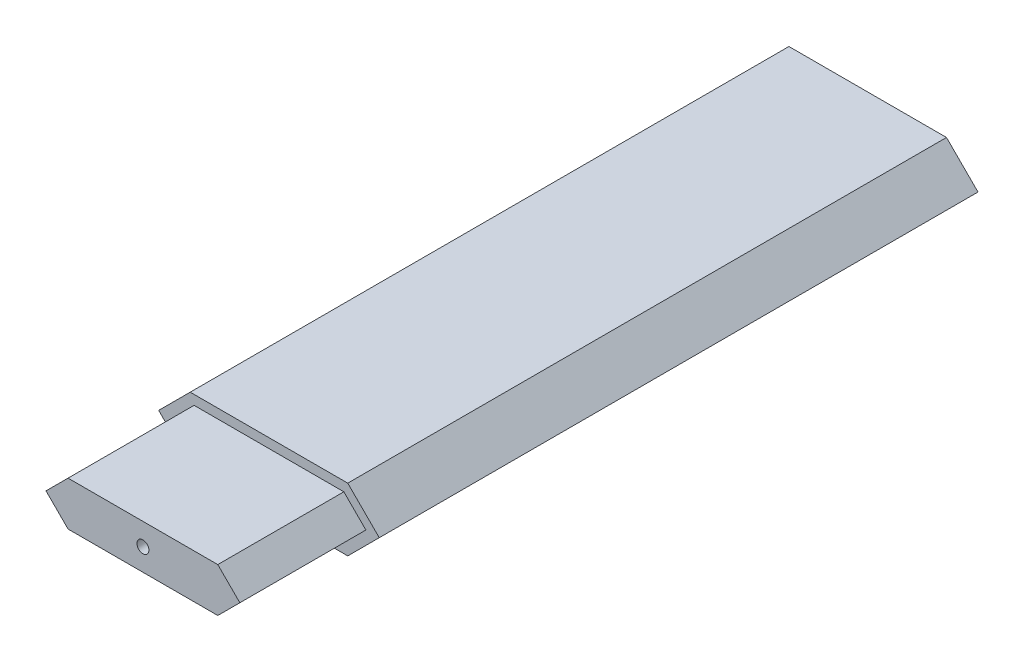
ISO-10303-21;
HEADER;
FILE_DESCRIPTION(('STEP AP214'),'2;1');
FILE_NAME('part.step','',(''),(''),'','','');
FILE_SCHEMA(('AUTOMOTIVE_DESIGN { 1 0 10303 214 1 1 1 1 }'));
ENDSEC;
DATA;
#1=APPLICATION_CONTEXT('core data for automotive mechanical design processes');
#2=APPLICATION_PROTOCOL_DEFINITION('international standard','automotive_design',2000,#1);
#3=PRODUCT_CONTEXT('',#1,'mechanical');
#4=PRODUCT('Part','Part','',(#3));
#5=PRODUCT_RELATED_PRODUCT_CATEGORY('part','',(#4));
#6=PRODUCT_DEFINITION_FORMATION('','',#4);
#7=PRODUCT_DEFINITION_CONTEXT('part definition',#1,'design');
#8=PRODUCT_DEFINITION('design','',#6,#7);
#9=PRODUCT_DEFINITION_SHAPE('','',#8);
#10=(LENGTH_UNIT() NAMED_UNIT(*) SI_UNIT(.MILLI.,.METRE.));
#11=(NAMED_UNIT(*) PLANE_ANGLE_UNIT() SI_UNIT($,.RADIAN.));
#12=(NAMED_UNIT(*) SI_UNIT($,.STERADIAN.) SOLID_ANGLE_UNIT());
#13=UNCERTAINTY_MEASURE_WITH_UNIT(LENGTH_MEASURE(1.E-05),#10,'distance_accuracy_value','');
#14=(GEOMETRIC_REPRESENTATION_CONTEXT(3) GLOBAL_UNCERTAINTY_ASSIGNED_CONTEXT((#13)) GLOBAL_UNIT_ASSIGNED_CONTEXT((#10,
#11,#12)) REPRESENTATION_CONTEXT('',''));
#15=CARTESIAN_POINT('',(0.,0.,0.));
#16=DIRECTION('',(0.,0.,1.));
#17=DIRECTION('',(1.,0.,0.));
#18=AXIS2_PLACEMENT_3D('',#15,#16,#17);
#19=CARTESIAN_POINT('',(0.,0.,-195.0001));
#20=DIRECTION('',(0.,0.,1.));
#21=DIRECTION('',(1.,0.,0.));
#22=AXIS2_PLACEMENT_3D('',#19,#20,#21);
#23=CYLINDRICAL_SURFACE('',#22,1.9);
#24=CARTESIAN_POINT('',(0.,0.,35.));
#25=DIRECTION('',(0.,0.,1.));
#26=DIRECTION('',(1.,0.,0.));
#27=AXIS2_PLACEMENT_3D('',#24,#25,#26);
#28=CIRCLE('',#27,1.9);
#29=CARTESIAN_POINT('',(1.9,0.,35.));
#30=VERTEX_POINT('',#29);
#31=EDGE_CURVE('E342',#30,#30,#28,.T.);
#32=ORIENTED_EDGE('',*,*,#31,.T.);
#33=EDGE_LOOP('',(#32));
#34=FACE_BOUND('',#33,.T.);
#35=CARTESIAN_POINT('',(0.,0.,-154.));
#36=DIRECTION('',(0.,0.,-1.));
#37=DIRECTION('',(-1.,0.,0.));
#38=AXIS2_PLACEMENT_3D('',#35,#36,#37);
#39=CIRCLE('',#38,1.9);
#40=CARTESIAN_POINT('',(-1.9,0.,-154.));
#41=VERTEX_POINT('',#40);
#42=EDGE_CURVE('E126',#41,#41,#39,.F.);
#43=ORIENTED_EDGE('',*,*,#42,.F.);
#44=EDGE_LOOP('',(#43));
#45=FACE_BOUND('',#44,.T.);
#46=ADVANCED_FACE('F121',(#34,#45),#23,.F.);
#47=CARTESIAN_POINT('',(0.,0.,35.));
#48=DIRECTION('',(0.,0.,1.));
#49=DIRECTION('',(1.,0.,0.));
#50=AXIS2_PLACEMENT_3D('',#47,#48,#49);
#51=PLANE('',#50);
#52=ORIENTED_EDGE('',*,*,#31,.F.);
#53=EDGE_LOOP('',(#52));
#54=FACE_BOUND('',#53,.T.);
#55=DIRECTION('',(1.,0.,0.));
#56=VECTOR('',#55,1.);
#57=CARTESIAN_POINT('',(-23.7573593128807,-7.,35.));
#58=LINE('',#57,#56);
#59=CARTESIAN_POINT('',(-23.7573593128807,-7.,35.));
#60=VERTEX_POINT('',#59);
#61=CARTESIAN_POINT('',(23.7573593128807,-6.99999999999999,35.));
#62=VERTEX_POINT('',#61);
#63=EDGE_CURVE('E309',#60,#62,#58,.T.);
#64=ORIENTED_EDGE('',*,*,#63,.T.);
#65=DIRECTION('',(0.707106781186547,0.707106781186548,0.));
#66=VECTOR('',#65,1.);
#67=CARTESIAN_POINT('',(23.7573593128807,-6.99999999999999,35.));
#68=LINE('',#67,#66);
#69=CARTESIAN_POINT('',(30.7573593128807,0.,35.));
#70=VERTEX_POINT('',#69);
#71=EDGE_CURVE('E325',#62,#70,#68,.T.);
#72=ORIENTED_EDGE('',*,*,#71,.T.);
#73=DIRECTION('',(-0.707106781186547,0.707106781186548,0.));
#74=VECTOR('',#73,1.);
#75=CARTESIAN_POINT('',(30.7573593128807,0.,35.));
#76=LINE('',#75,#74);
#77=CARTESIAN_POINT('',(23.7573593128808,6.99999999999991,35.));
#78=VERTEX_POINT('',#77);
#79=EDGE_CURVE('E328',#70,#78,#76,.T.);
#80=ORIENTED_EDGE('',*,*,#79,.T.);
#81=DIRECTION('',(-1.,0.,0.));
#82=VECTOR('',#81,1.);
#83=CARTESIAN_POINT('',(23.7573593128808,6.99999999999991,35.));
#84=LINE('',#83,#82);
#85=CARTESIAN_POINT('',(-23.7573593128807,7.00000000000001,35.));
#86=VERTEX_POINT('',#85);
#87=EDGE_CURVE('E147',#78,#86,#84,.T.);
#88=ORIENTED_EDGE('',*,*,#87,.T.);
#89=DIRECTION('',(-0.707106781186547,-0.707106781186548,0.));
#90=VECTOR('',#89,1.);
#91=CARTESIAN_POINT('',(-23.7573593128807,7.00000000000001,35.));
#92=LINE('',#91,#90);
#93=CARTESIAN_POINT('',(-30.7573593128807,0.,35.));
#94=VERTEX_POINT('',#93);
#95=EDGE_CURVE('E332',#86,#94,#92,.T.);
#96=ORIENTED_EDGE('',*,*,#95,.T.);
#97=DIRECTION('',(0.707106781186547,-0.707106781186548,0.));
#98=VECTOR('',#97,1.);
#99=CARTESIAN_POINT('',(-30.7573593128807,0.,35.));
#100=LINE('',#99,#98);
#101=EDGE_CURVE('E335',#94,#60,#100,.T.);
#102=ORIENTED_EDGE('',*,*,#101,.T.);
#103=EDGE_LOOP('',(#64,#72,#80,#88,#96,#102));
#104=FACE_BOUND('',#103,.T.);
#105=ADVANCED_FACE('F502',(#54,#104),#51,.T.);
#106=CARTESIAN_POINT('',(0.,-22.5001,-195.));
#107=DIRECTION('',(0.,0.,1.));
#108=DIRECTION('',(1.,0.,0.));
#109=AXIS2_PLACEMENT_3D('',#106,#107,#108);
#110=PLANE('',#109);
#111=DIRECTION('',(-0.707106781186547,-0.707106781186548,0.));
#112=VECTOR('',#111,1.);
#113=CARTESIAN_POINT('',(28.2117749006092,0.,-195.));
#114=LINE('',#113,#112);
#115=CARTESIAN_POINT('',(28.2117749006092,0.,-195.));
#116=VERTEX_POINT('',#115);
#117=CARTESIAN_POINT('',(23.0117749006092,-5.2,-195.));
#118=VERTEX_POINT('',#117);
#119=EDGE_CURVE('E286',#116,#118,#114,.T.);
#120=ORIENTED_EDGE('',*,*,#119,.F.);
#121=DIRECTION('',(0.707106781186547,-0.707106781186548,0.));
#122=VECTOR('',#121,1.);
#123=CARTESIAN_POINT('',(23.0117749006092,5.2,-195.));
#124=LINE('',#123,#122);
#125=CARTESIAN_POINT('',(23.0117749006092,5.2,-195.));
#126=VERTEX_POINT('',#125);
#127=EDGE_CURVE('E139',#126,#116,#124,.T.);
#128=ORIENTED_EDGE('',*,*,#127,.F.);
#129=DIRECTION('',(1.,0.,0.));
#130=VECTOR('',#129,1.);
#131=CARTESIAN_POINT('',(-23.0117749006092,5.2,-195.));
#132=LINE('',#131,#130);
#133=CARTESIAN_POINT('',(-23.0117749006092,5.2,-195.));
#134=VERTEX_POINT('',#133);
#135=EDGE_CURVE('E272',#134,#126,#132,.T.);
#136=ORIENTED_EDGE('',*,*,#135,.F.);
#137=DIRECTION('',(0.707106781186548,0.707106781186547,0.));
#138=VECTOR('',#137,1.);
#139=CARTESIAN_POINT('',(-28.2117749006092,0.,-195.));
#140=LINE('',#139,#138);
#141=CARTESIAN_POINT('',(-28.2117749006092,0.,-195.));
#142=VERTEX_POINT('',#141);
#143=EDGE_CURVE('E275',#142,#134,#140,.T.);
#144=ORIENTED_EDGE('',*,*,#143,.F.);
#145=DIRECTION('',(-0.707106781186548,0.707106781186548,0.));
#146=VECTOR('',#145,1.);
#147=CARTESIAN_POINT('',(-23.0117749006092,-5.2,-195.));
#148=LINE('',#147,#146);
#149=CARTESIAN_POINT('',(-23.0117749006092,-5.2,-195.));
#150=VERTEX_POINT('',#149);
#151=EDGE_CURVE('E291',#150,#142,#148,.T.);
#152=ORIENTED_EDGE('',*,*,#151,.F.);
#153=DIRECTION('',(-1.,0.,0.));
#154=VECTOR('',#153,1.);
#155=CARTESIAN_POINT('',(23.0117749006092,-5.2,-195.));
#156=LINE('',#155,#154);
#157=EDGE_CURVE('E288',#118,#150,#156,.T.);
#158=ORIENTED_EDGE('',*,*,#157,.F.);
#159=EDGE_LOOP('',(#120,#128,#136,#144,#152,#158));
#160=FACE_BOUND('',#159,.T.);
#161=DIRECTION('',(-0.707106781186547,-0.707106781186548,0.));
#162=VECTOR('',#161,1.);
#163=CARTESIAN_POINT('',(17.5,-17.5,-195.));
#164=LINE('',#163,#162);
#165=CARTESIAN_POINT('',(35.,0.,-195.));
#166=VERTEX_POINT('',#165);
#167=CARTESIAN_POINT('',(25.,-10.,-195.));
#168=VERTEX_POINT('',#167);
#169=EDGE_CURVE('E367',#166,#168,#164,.T.);
#170=ORIENTED_EDGE('',*,*,#169,.T.);
#171=DIRECTION('',(-1.,0.,0.));
#172=VECTOR('',#171,1.);
#173=CARTESIAN_POINT('',(0.,-10.,-195.));
#174=LINE('',#173,#172);
#175=CARTESIAN_POINT('',(-25.,-10.,-195.));
#176=VERTEX_POINT('',#175);
#177=EDGE_CURVE('E372',#168,#176,#174,.T.);
#178=ORIENTED_EDGE('',*,*,#177,.T.);
#179=DIRECTION('',(-0.707106781186547,0.707106781186548,0.));
#180=VECTOR('',#179,1.);
#181=CARTESIAN_POINT('',(-17.5,-17.5,-195.));
#182=LINE('',#181,#180);
#183=CARTESIAN_POINT('',(-35.,0.,-195.));
#184=VERTEX_POINT('',#183);
#185=EDGE_CURVE('E362',#176,#184,#182,.T.);
#186=ORIENTED_EDGE('',*,*,#185,.T.);
#187=DIRECTION('',(0.707106781186547,0.707106781186548,0.));
#188=VECTOR('',#187,1.);
#189=CARTESIAN_POINT('',(-17.5,17.5,-195.));
#190=LINE('',#189,#188);
#191=CARTESIAN_POINT('',(-25.,10.,-195.));
#192=VERTEX_POINT('',#191);
#193=EDGE_CURVE('E357',#184,#192,#190,.T.);
#194=ORIENTED_EDGE('',*,*,#193,.T.);
#195=DIRECTION('',(1.,0.,0.));
#196=VECTOR('',#195,1.);
#197=CARTESIAN_POINT('',(0.,10.,-195.));
#198=LINE('',#197,#196);
#199=CARTESIAN_POINT('',(25.,10.,-195.));
#200=VERTEX_POINT('',#199);
#201=EDGE_CURVE('E13',#192,#200,#198,.T.);
#202=ORIENTED_EDGE('',*,*,#201,.T.);
#203=DIRECTION('',(0.707106781186547,-0.707106781186548,0.));
#204=VECTOR('',#203,1.);
#205=CARTESIAN_POINT('',(17.5,17.5,-195.));
#206=LINE('',#205,#204);
#207=EDGE_CURVE('E354',#200,#166,#206,.T.);
#208=ORIENTED_EDGE('',*,*,#207,.T.);
#209=EDGE_LOOP('',(#170,#178,#186,#194,#202,#208));
#210=FACE_BOUND('',#209,.T.);
#211=ADVANCED_FACE('F498',(#160,#210),#110,.F.);
#212=CARTESIAN_POINT('',(17.5,-17.5,0.));
#213=DIRECTION('',(0.707106781186548,-0.707106781186547,0.));
#214=DIRECTION('',(-0.707106781186547,-0.707106781186548,0.));
#215=AXIS2_PLACEMENT_3D('',#212,#213,#214);
#216=PLANE('',#215);
#217=ORIENTED_EDGE('',*,*,#169,.F.);
#218=DIRECTION('',(0.,0.,-1.));
#219=VECTOR('',#218,1.);
#220=CARTESIAN_POINT('',(35.,0.,0.));
#221=LINE('',#220,#219);
#222=CARTESIAN_POINT('',(35.,0.,-5.));
#223=VERTEX_POINT('',#222);
#224=EDGE_CURVE('E753',#223,#166,#221,.T.);
#225=ORIENTED_EDGE('',*,*,#224,.F.);
#226=DIRECTION('',(0.707106781186547,0.707106781186548,0.));
#227=VECTOR('',#226,1.);
#228=CARTESIAN_POINT('',(17.5,-17.5,-5.));
#229=LINE('',#228,#227);
#230=CARTESIAN_POINT('',(25.,-10.,-5.));
#231=VERTEX_POINT('',#230);
#232=EDGE_CURVE('E389',#231,#223,#229,.T.);
#233=ORIENTED_EDGE('',*,*,#232,.F.);
#234=CARTESIAN_POINT('',(25.,-10.,-5.00000000000006));
#235=DIRECTION('',(0.,0.,-1.));
#236=VECTOR('',#235,1.);
#237=LINE('',#234,#236);
#238=EDGE_CURVE('E397',#231,#168,#237,.T.);
#239=ORIENTED_EDGE('',*,*,#238,.T.);
#240=EDGE_LOOP('',(#217,#225,#233,#239));
#241=FACE_BOUND('',#240,.T.);
#242=ADVANCED_FACE('F419',(#241),#216,.T.);
#243=CARTESIAN_POINT('',(-17.5,-17.5,0.));
#244=DIRECTION('',(-0.707106781186548,-0.707106781186547,0.));
#245=DIRECTION('',(-0.707106781186547,0.707106781186548,0.));
#246=AXIS2_PLACEMENT_3D('',#243,#244,#245);
#247=PLANE('',#246);
#248=ORIENTED_EDGE('',*,*,#185,.F.);
#249=CARTESIAN_POINT('',(-25.,-10.,-195.));
#250=DIRECTION('',(0.,0.,1.));
#251=VECTOR('',#250,1.);
#252=LINE('',#249,#251);
#253=CARTESIAN_POINT('',(-25.,-10.,-5.));
#254=VERTEX_POINT('',#253);
#255=EDGE_CURVE('E482',#176,#254,#252,.T.);
#256=ORIENTED_EDGE('',*,*,#255,.T.);
#257=DIRECTION('',(0.707106781186547,-0.707106781186548,0.));
#258=VECTOR('',#257,1.);
#259=CARTESIAN_POINT('',(-17.5,-17.5,-5.));
#260=LINE('',#259,#258);
#261=CARTESIAN_POINT('',(-35.,0.,-5.));
#262=VERTEX_POINT('',#261);
#263=EDGE_CURVE('E131',#262,#254,#260,.T.);
#264=ORIENTED_EDGE('',*,*,#263,.F.);
#265=DIRECTION('',(0.,0.,1.));
#266=VECTOR('',#265,1.);
#267=CARTESIAN_POINT('',(-35.,0.,0.));
#268=LINE('',#267,#266);
#269=EDGE_CURVE('E479',#184,#262,#268,.T.);
#270=ORIENTED_EDGE('',*,*,#269,.F.);
#271=EDGE_LOOP('',(#248,#256,#264,#270));
#272=FACE_BOUND('',#271,.T.);
#273=ADVANCED_FACE('F409',(#272),#247,.T.);
#274=CARTESIAN_POINT('',(0.,-10.,0.));
#275=DIRECTION('',(0.,-1.,0.));
#276=DIRECTION('',(0.,0.,1.));
#277=AXIS2_PLACEMENT_3D('',#274,#275,#276);
#278=PLANE('',#277);
#279=ORIENTED_EDGE('',*,*,#177,.F.);
#280=ORIENTED_EDGE('',*,*,#238,.F.);
#281=DIRECTION('',(1.,0.,0.));
#282=VECTOR('',#281,1.);
#283=CARTESIAN_POINT('',(0.,-10.,-5.));
#284=LINE('',#283,#282);
#285=EDGE_CURVE('E377',#254,#231,#284,.T.);
#286=ORIENTED_EDGE('',*,*,#285,.F.);
#287=ORIENTED_EDGE('',*,*,#255,.F.);
#288=EDGE_LOOP('',(#279,#280,#286,#287));
#289=FACE_BOUND('',#288,.T.);
#290=ADVANCED_FACE('F418',(#289),#278,.T.);
#291=CARTESIAN_POINT('',(-17.5,17.5,0.));
#292=DIRECTION('',(-0.707106781186548,0.707106781186547,0.));
#293=DIRECTION('',(-0.707106781186547,-0.707106781186548,0.));
#294=AXIS2_PLACEMENT_3D('',#291,#292,#293);
#295=PLANE('',#294);
#296=ORIENTED_EDGE('',*,*,#193,.F.);
#297=ORIENTED_EDGE('',*,*,#269,.T.);
#298=DIRECTION('',(-0.707106781186547,-0.707106781186548,0.));
#299=VECTOR('',#298,1.);
#300=CARTESIAN_POINT('',(-17.5,17.5,-5.));
#301=LINE('',#300,#299);
#302=CARTESIAN_POINT('',(-25.,10.,-5.));
#303=VERTEX_POINT('',#302);
#304=EDGE_CURVE('E381',#303,#262,#301,.T.);
#305=ORIENTED_EDGE('',*,*,#304,.F.);
#306=DIRECTION('',(0.,0.,1.));
#307=VECTOR('',#306,1.);
#308=CARTESIAN_POINT('',(-25.,10.,0.));
#309=LINE('',#308,#307);
#310=EDGE_CURVE('E452',#192,#303,#309,.T.);
#311=ORIENTED_EDGE('',*,*,#310,.F.);
#312=EDGE_LOOP('',(#296,#297,#305,#311));
#313=FACE_BOUND('',#312,.T.);
#314=ADVANCED_FACE('F123',(#313),#295,.T.);
#315=CARTESIAN_POINT('',(17.5,17.5,0.));
#316=DIRECTION('',(0.707106781186548,0.707106781186547,0.));
#317=DIRECTION('',(-0.707106781186547,0.707106781186548,0.));
#318=AXIS2_PLACEMENT_3D('',#315,#316,#317);
#319=PLANE('',#318);
#320=ORIENTED_EDGE('',*,*,#207,.F.);
#321=DIRECTION('',(0.,0.,-1.));
#322=VECTOR('',#321,1.);
#323=CARTESIAN_POINT('',(25.,10.,0.));
#324=LINE('',#323,#322);
#325=CARTESIAN_POINT('',(25.,10.,-5.00000000000003));
#326=VERTEX_POINT('',#325);
#327=EDGE_CURVE('E480',#326,#200,#324,.T.);
#328=ORIENTED_EDGE('',*,*,#327,.F.);
#329=DIRECTION('',(-0.707106781186547,0.707106781186548,0.));
#330=VECTOR('',#329,1.);
#331=CARTESIAN_POINT('',(17.5,17.5,-5.));
#332=LINE('',#331,#330);
#333=EDGE_CURVE('E393',#223,#326,#332,.T.);
#334=ORIENTED_EDGE('',*,*,#333,.F.);
#335=ORIENTED_EDGE('',*,*,#224,.T.);
#336=EDGE_LOOP('',(#320,#328,#334,#335));
#337=FACE_BOUND('',#336,.T.);
#338=ADVANCED_FACE('F427',(#337),#319,.T.);
#339=CARTESIAN_POINT('',(0.,10.,0.));
#340=DIRECTION('',(0.,1.,0.));
#341=DIRECTION('',(0.,0.,1.));
#342=AXIS2_PLACEMENT_3D('',#339,#340,#341);
#343=PLANE('',#342);
#344=ORIENTED_EDGE('',*,*,#201,.F.);
#345=ORIENTED_EDGE('',*,*,#310,.T.);
#346=DIRECTION('',(-1.,0.,0.));
#347=VECTOR('',#346,1.);
#348=CARTESIAN_POINT('',(0.,10.,-5.));
#349=LINE('',#348,#347);
#350=EDGE_CURVE('E385',#326,#303,#349,.T.);
#351=ORIENTED_EDGE('',*,*,#350,.F.);
#352=ORIENTED_EDGE('',*,*,#327,.T.);
#353=EDGE_LOOP('',(#344,#345,#351,#352));
#354=FACE_BOUND('',#353,.T.);
#355=ADVANCED_FACE('F423',(#354),#343,.T.);
#356=CARTESIAN_POINT('',(0.,0.,-5.));
#357=DIRECTION('',(0.,0.,1.));
#358=DIRECTION('',(1.,0.,0.));
#359=AXIS2_PLACEMENT_3D('',#356,#357,#358);
#360=PLANE('',#359);
#361=ORIENTED_EDGE('',*,*,#232,.T.);
#362=ORIENTED_EDGE('',*,*,#333,.T.);
#363=ORIENTED_EDGE('',*,*,#350,.T.);
#364=ORIENTED_EDGE('',*,*,#304,.T.);
#365=ORIENTED_EDGE('',*,*,#263,.T.);
#366=ORIENTED_EDGE('',*,*,#285,.T.);
#367=EDGE_LOOP('',(#361,#362,#363,#364,#365,#366));
#368=FACE_BOUND('',#367,.T.);
#369=DIRECTION('',(1.,0.,0.));
#370=VECTOR('',#369,1.);
#371=CARTESIAN_POINT('',(-23.7573593128807,-7.,-5.));
#372=LINE('',#371,#370);
#373=CARTESIAN_POINT('',(-23.7573593128807,-7.,-5.));
#374=VERTEX_POINT('',#373);
#375=CARTESIAN_POINT('',(23.7573593128807,-6.99999999999999,-5.));
#376=VERTEX_POINT('',#375);
#377=EDGE_CURVE('E321',#374,#376,#372,.T.);
#378=ORIENTED_EDGE('',*,*,#377,.F.);
#379=DIRECTION('',(0.707106781186547,-0.707106781186548,0.));
#380=VECTOR('',#379,1.);
#381=CARTESIAN_POINT('',(-30.7573593128807,0.,-5.));
#382=LINE('',#381,#380);
#383=CARTESIAN_POINT('',(-30.7573593128807,0.,-5.));
#384=VERTEX_POINT('',#383);
#385=EDGE_CURVE('E318',#384,#374,#382,.T.);
#386=ORIENTED_EDGE('',*,*,#385,.F.);
#387=DIRECTION('',(-0.707106781186547,-0.707106781186548,0.));
#388=VECTOR('',#387,1.);
#389=CARTESIAN_POINT('',(-23.7573593128807,7.00000000000001,-5.));
#390=LINE('',#389,#388);
#391=CARTESIAN_POINT('',(-23.7573593128807,7.00000000000001,-5.));
#392=VERTEX_POINT('',#391);
#393=EDGE_CURVE('E315',#392,#384,#390,.T.);
#394=ORIENTED_EDGE('',*,*,#393,.F.);
#395=DIRECTION('',(-1.,0.,0.));
#396=VECTOR('',#395,1.);
#397=CARTESIAN_POINT('',(23.7573593128808,6.99999999999991,-5.));
#398=LINE('',#397,#396);
#399=CARTESIAN_POINT('',(23.7573593128808,6.99999999999991,-5.));
#400=VERTEX_POINT('',#399);
#401=EDGE_CURVE('E312',#400,#392,#398,.T.);
#402=ORIENTED_EDGE('',*,*,#401,.F.);
#403=DIRECTION('',(-0.707106781186547,0.707106781186548,0.));
#404=VECTOR('',#403,1.);
#405=CARTESIAN_POINT('',(30.7573593128807,0.,-5.));
#406=LINE('',#405,#404);
#407=CARTESIAN_POINT('',(30.7573593128807,0.,-5.));
#408=VERTEX_POINT('',#407);
#409=EDGE_CURVE('E308',#408,#400,#406,.T.);
#410=ORIENTED_EDGE('',*,*,#409,.F.);
#411=DIRECTION('',(0.707106781186547,0.707106781186548,0.));
#412=VECTOR('',#411,1.);
#413=CARTESIAN_POINT('',(23.7573593128807,-6.99999999999999,-5.));
#414=LINE('',#413,#412);
#415=EDGE_CURVE('E305',#376,#408,#414,.T.);
#416=ORIENTED_EDGE('',*,*,#415,.F.);
#417=EDGE_LOOP('',(#378,#386,#394,#402,#410,#416));
#418=FACE_BOUND('',#417,.T.);
#419=ADVANCED_FACE('F426',(#368,#418),#360,.T.);
#420=CARTESIAN_POINT('',(23.7573593128807,-6.99999999999999,-5.));
#421=DIRECTION('',(0.707106781186548,-0.707106781186547,0.));
#422=DIRECTION('',(0.707106781186547,0.707106781186548,0.));
#423=AXIS2_PLACEMENT_3D('',#420,#421,#422);
#424=PLANE('',#423);
#425=ORIENTED_EDGE('',*,*,#71,.F.);
#426=DIRECTION('',(0.,0.,1.));
#427=VECTOR('',#426,1.);
#428=CARTESIAN_POINT('',(23.7573593128807,-6.99999999999999,-5.));
#429=LINE('',#428,#427);
#430=EDGE_CURVE('E340',#376,#62,#429,.T.);
#431=ORIENTED_EDGE('',*,*,#430,.F.);
#432=ORIENTED_EDGE('',*,*,#415,.T.);
#433=DIRECTION('',(0.,0.,1.));
#434=VECTOR('',#433,1.);
#435=CARTESIAN_POINT('',(30.7573593128807,0.,-5.));
#436=LINE('',#435,#434);
#437=EDGE_CURVE('E324',#408,#70,#436,.T.);
#438=ORIENTED_EDGE('',*,*,#437,.T.);
#439=EDGE_LOOP('',(#425,#431,#432,#438));
#440=FACE_BOUND('',#439,.T.);
#441=ADVANCED_FACE('F512',(#440),#424,.T.);
#442=CARTESIAN_POINT('',(-23.7573593128807,-7.,-5.));
#443=DIRECTION('',(0.,-1.,0.));
#444=DIRECTION('',(1.,0.,0.));
#445=AXIS2_PLACEMENT_3D('',#442,#443,#444);
#446=PLANE('',#445);
#447=ORIENTED_EDGE('',*,*,#63,.F.);
#448=DIRECTION('',(0.,0.,1.));
#449=VECTOR('',#448,1.);
#450=CARTESIAN_POINT('',(-23.7573593128807,-7.,-5.));
#451=LINE('',#450,#449);
#452=EDGE_CURVE('E343',#374,#60,#451,.T.);
#453=ORIENTED_EDGE('',*,*,#452,.F.);
#454=ORIENTED_EDGE('',*,*,#377,.T.);
#455=ORIENTED_EDGE('',*,*,#430,.T.);
#456=EDGE_LOOP('',(#447,#453,#454,#455));
#457=FACE_BOUND('',#456,.T.);
#458=ADVANCED_FACE('F516',(#457),#446,.T.);
#459=CARTESIAN_POINT('',(-30.7573593128807,0.,-5.));
#460=DIRECTION('',(-0.707106781186548,-0.707106781186547,0.));
#461=DIRECTION('',(0.707106781186547,-0.707106781186548,0.));
#462=AXIS2_PLACEMENT_3D('',#459,#460,#461);
#463=PLANE('',#462);
#464=ORIENTED_EDGE('',*,*,#101,.F.);
#465=DIRECTION('',(0.,0.,1.));
#466=VECTOR('',#465,1.);
#467=CARTESIAN_POINT('',(-30.7573593128807,0.,-5.));
#468=LINE('',#467,#466);
#469=EDGE_CURVE('E345',#384,#94,#468,.T.);
#470=ORIENTED_EDGE('',*,*,#469,.F.);
#471=ORIENTED_EDGE('',*,*,#385,.T.);
#472=ORIENTED_EDGE('',*,*,#452,.T.);
#473=EDGE_LOOP('',(#464,#470,#471,#472));
#474=FACE_BOUND('',#473,.T.);
#475=ADVANCED_FACE('F528',(#474),#463,.T.);
#476=CARTESIAN_POINT('',(-23.7573593128807,7.00000000000001,-5.));
#477=DIRECTION('',(-0.707106781186548,0.707106781186547,0.));
#478=DIRECTION('',(-0.707106781186547,-0.707106781186548,0.));
#479=AXIS2_PLACEMENT_3D('',#476,#477,#478);
#480=PLANE('',#479);
#481=ORIENTED_EDGE('',*,*,#95,.F.);
#482=DIRECTION('',(0.,0.,1.));
#483=VECTOR('',#482,1.);
#484=CARTESIAN_POINT('',(-23.7573593128807,7.00000000000001,-5.));
#485=LINE('',#484,#483);
#486=EDGE_CURVE('E347',#392,#86,#485,.T.);
#487=ORIENTED_EDGE('',*,*,#486,.F.);
#488=ORIENTED_EDGE('',*,*,#393,.T.);
#489=ORIENTED_EDGE('',*,*,#469,.T.);
#490=EDGE_LOOP('',(#481,#487,#488,#489));
#491=FACE_BOUND('',#490,.T.);
#492=ADVANCED_FACE('F525',(#491),#480,.T.);
#493=CARTESIAN_POINT('',(23.7573593128808,6.99999999999991,-5.));
#494=DIRECTION('',(0.,1.,0.));
#495=DIRECTION('',(-1.,0.,0.));
#496=AXIS2_PLACEMENT_3D('',#493,#494,#495);
#497=PLANE('',#496);
#498=ORIENTED_EDGE('',*,*,#87,.F.);
#499=DIRECTION('',(0.,0.,1.));
#500=VECTOR('',#499,1.);
#501=CARTESIAN_POINT('',(23.7573593128808,6.99999999999991,-5.));
#502=LINE('',#501,#500);
#503=EDGE_CURVE('E349',#400,#78,#502,.T.);
#504=ORIENTED_EDGE('',*,*,#503,.F.);
#505=ORIENTED_EDGE('',*,*,#401,.T.);
#506=ORIENTED_EDGE('',*,*,#486,.T.);
#507=EDGE_LOOP('',(#498,#504,#505,#506));
#508=FACE_BOUND('',#507,.T.);
#509=ADVANCED_FACE('F521',(#508),#497,.T.);
#510=CARTESIAN_POINT('',(30.7573593128807,0.,-5.));
#511=DIRECTION('',(0.707106781186548,0.707106781186547,0.));
#512=DIRECTION('',(-0.707106781186547,0.707106781186548,0.));
#513=AXIS2_PLACEMENT_3D('',#510,#511,#512);
#514=PLANE('',#513);
#515=ORIENTED_EDGE('',*,*,#79,.F.);
#516=ORIENTED_EDGE('',*,*,#437,.F.);
#517=ORIENTED_EDGE('',*,*,#409,.T.);
#518=ORIENTED_EDGE('',*,*,#503,.T.);
#519=EDGE_LOOP('',(#515,#516,#517,#518));
#520=FACE_BOUND('',#519,.T.);
#521=ADVANCED_FACE('F518',(#520),#514,.T.);
#522=CARTESIAN_POINT('',(0.,0.,-154.));
#523=DIRECTION('',(0.,0.,-1.));
#524=DIRECTION('',(-1.,0.,0.));
#525=AXIS2_PLACEMENT_3D('',#522,#523,#524);
#526=PLANE('',#525);
#527=DIRECTION('',(0.707106781186547,-0.707106781186548,0.));
#528=VECTOR('',#527,1.);
#529=CARTESIAN_POINT('',(23.0117749006092,5.2,-154.));
#530=LINE('',#529,#528);
#531=CARTESIAN_POINT('',(23.0117749006092,5.2,-154.));
#532=VERTEX_POINT('',#531);
#533=CARTESIAN_POINT('',(28.2117749006092,0.,-154.));
#534=VERTEX_POINT('',#533);
#535=EDGE_CURVE('E252',#532,#534,#530,.T.);
#536=ORIENTED_EDGE('',*,*,#535,.T.);
#537=DIRECTION('',(-0.707106781186547,-0.707106781186548,0.));
#538=VECTOR('',#537,1.);
#539=CARTESIAN_POINT('',(28.2117749006092,0.,-154.));
#540=LINE('',#539,#538);
#541=CARTESIAN_POINT('',(23.0117749006092,-5.2,-154.));
#542=VERTEX_POINT('',#541);
#543=EDGE_CURVE('E261',#534,#542,#540,.T.);
#544=ORIENTED_EDGE('',*,*,#543,.T.);
#545=DIRECTION('',(-1.,0.,0.));
#546=VECTOR('',#545,1.);
#547=CARTESIAN_POINT('',(23.0117749006092,-5.2,-154.));
#548=LINE('',#547,#546);
#549=CARTESIAN_POINT('',(-23.0117749006092,-5.2,-154.));
#550=VERTEX_POINT('',#549);
#551=EDGE_CURVE('E266',#542,#550,#548,.T.);
#552=ORIENTED_EDGE('',*,*,#551,.T.);
#553=DIRECTION('',(-0.707106781186548,0.707106781186548,0.));
#554=VECTOR('',#553,1.);
#555=CARTESIAN_POINT('',(-23.0117749006092,-5.2,-154.));
#556=LINE('',#555,#554);
#557=CARTESIAN_POINT('',(-28.2117749006092,0.,-154.));
#558=VERTEX_POINT('',#557);
#559=EDGE_CURVE('E279',#550,#558,#556,.T.);
#560=ORIENTED_EDGE('',*,*,#559,.T.);
#561=DIRECTION('',(0.707106781186548,0.707106781186547,0.));
#562=VECTOR('',#561,1.);
#563=CARTESIAN_POINT('',(-28.2117749006092,0.,-154.));
#564=LINE('',#563,#562);
#565=CARTESIAN_POINT('',(-23.0117749006092,5.2,-154.));
#566=VERTEX_POINT('',#565);
#567=EDGE_CURVE('E282',#558,#566,#564,.T.);
#568=ORIENTED_EDGE('',*,*,#567,.T.);
#569=DIRECTION('',(1.,0.,0.));
#570=VECTOR('',#569,1.);
#571=CARTESIAN_POINT('',(-23.0117749006092,5.2,-154.));
#572=LINE('',#571,#570);
#573=EDGE_CURVE('E258',#566,#532,#572,.T.);
#574=ORIENTED_EDGE('',*,*,#573,.T.);
#575=EDGE_LOOP('',(#536,#544,#552,#560,#568,#574));
#576=FACE_BOUND('',#575,.T.);
#577=ORIENTED_EDGE('',*,*,#42,.T.);
#578=EDGE_LOOP('',(#577));
#579=FACE_BOUND('',#578,.T.);
#580=ADVANCED_FACE('F268',(#576,#579),#526,.T.);
#581=CARTESIAN_POINT('',(23.0117749006092,5.2,-154.));
#582=DIRECTION('',(0.707106781186548,0.707106781186547,0.));
#583=DIRECTION('',(-0.707106781186547,0.707106781186548,0.));
#584=AXIS2_PLACEMENT_3D('',#581,#582,#583);
#585=PLANE('',#584);
#586=ORIENTED_EDGE('',*,*,#127,.T.);
#587=DIRECTION('',(0.,0.,-1.));
#588=VECTOR('',#587,1.);
#589=CARTESIAN_POINT('',(28.2117749006092,0.,-154.));
#590=LINE('',#589,#588);
#591=EDGE_CURVE('E248',#534,#116,#590,.T.);
#592=ORIENTED_EDGE('',*,*,#591,.F.);
#593=ORIENTED_EDGE('',*,*,#535,.F.);
#594=DIRECTION('',(0.,0.,-1.));
#595=VECTOR('',#594,1.);
#596=CARTESIAN_POINT('',(23.0117749006092,5.2,-154.));
#597=LINE('',#596,#595);
#598=EDGE_CURVE('E296',#532,#126,#597,.T.);
#599=ORIENTED_EDGE('',*,*,#598,.T.);
#600=EDGE_LOOP('',(#586,#592,#593,#599));
#601=FACE_BOUND('',#600,.T.);
#602=ADVANCED_FACE('F250',(#601),#585,.F.);
#603=CARTESIAN_POINT('',(-23.0117749006092,5.2,-154.));
#604=DIRECTION('',(0.,1.,0.));
#605=DIRECTION('',(-1.,0.,0.));
#606=AXIS2_PLACEMENT_3D('',#603,#604,#605);
#607=PLANE('',#606);
#608=ORIENTED_EDGE('',*,*,#135,.T.);
#609=ORIENTED_EDGE('',*,*,#598,.F.);
#610=ORIENTED_EDGE('',*,*,#573,.F.);
#611=DIRECTION('',(0.,0.,-1.));
#612=VECTOR('',#611,1.);
#613=CARTESIAN_POINT('',(-23.0117749006092,5.2,-154.));
#614=LINE('',#613,#612);
#615=EDGE_CURVE('E298',#566,#134,#614,.T.);
#616=ORIENTED_EDGE('',*,*,#615,.T.);
#617=EDGE_LOOP('',(#608,#609,#610,#616));
#618=FACE_BOUND('',#617,.T.);
#619=ADVANCED_FACE('F538',(#618),#607,.F.);
#620=CARTESIAN_POINT('',(-28.2117749006092,0.,-154.));
#621=DIRECTION('',(-0.707106781186547,0.707106781186548,0.));
#622=DIRECTION('',(-0.707106781186548,-0.707106781186547,0.));
#623=AXIS2_PLACEMENT_3D('',#620,#621,#622);
#624=PLANE('',#623);
#625=ORIENTED_EDGE('',*,*,#143,.T.);
#626=ORIENTED_EDGE('',*,*,#615,.F.);
#627=ORIENTED_EDGE('',*,*,#567,.F.);
#628=DIRECTION('',(0.,0.,-1.));
#629=VECTOR('',#628,1.);
#630=CARTESIAN_POINT('',(-28.2117749006092,0.,-154.));
#631=LINE('',#630,#629);
#632=EDGE_CURVE('E300',#558,#142,#631,.T.);
#633=ORIENTED_EDGE('',*,*,#632,.T.);
#634=EDGE_LOOP('',(#625,#626,#627,#633));
#635=FACE_BOUND('',#634,.T.);
#636=ADVANCED_FACE('F548',(#635),#624,.F.);
#637=CARTESIAN_POINT('',(-23.0117749006092,-5.2,-154.));
#638=DIRECTION('',(-0.707106781186547,-0.707106781186547,0.));
#639=DIRECTION('',(0.707106781186548,-0.707106781186548,0.));
#640=AXIS2_PLACEMENT_3D('',#637,#638,#639);
#641=PLANE('',#640);
#642=ORIENTED_EDGE('',*,*,#151,.T.);
#643=ORIENTED_EDGE('',*,*,#632,.F.);
#644=ORIENTED_EDGE('',*,*,#559,.F.);
#645=DIRECTION('',(0.,0.,-1.));
#646=VECTOR('',#645,1.);
#647=CARTESIAN_POINT('',(-23.0117749006092,-5.2,-154.));
#648=LINE('',#647,#646);
#649=EDGE_CURVE('E302',#550,#150,#648,.T.);
#650=ORIENTED_EDGE('',*,*,#649,.T.);
#651=EDGE_LOOP('',(#642,#643,#644,#650));
#652=FACE_BOUND('',#651,.T.);
#653=ADVANCED_FACE('F544',(#652),#641,.F.);
#654=CARTESIAN_POINT('',(23.0117749006092,-5.2,-154.));
#655=DIRECTION('',(0.,-1.,0.));
#656=DIRECTION('',(1.,0.,0.));
#657=AXIS2_PLACEMENT_3D('',#654,#655,#656);
#658=PLANE('',#657);
#659=ORIENTED_EDGE('',*,*,#157,.T.);
#660=ORIENTED_EDGE('',*,*,#649,.F.);
#661=ORIENTED_EDGE('',*,*,#551,.F.);
#662=DIRECTION('',(0.,0.,-1.));
#663=VECTOR('',#662,1.);
#664=CARTESIAN_POINT('',(23.0117749006092,-5.2,-154.));
#665=LINE('',#664,#663);
#666=EDGE_CURVE('E257',#542,#118,#665,.T.);
#667=ORIENTED_EDGE('',*,*,#666,.T.);
#668=EDGE_LOOP('',(#659,#660,#661,#667));
#669=FACE_BOUND('',#668,.T.);
#670=ADVANCED_FACE('F541',(#669),#658,.F.);
#671=CARTESIAN_POINT('',(28.2117749006092,0.,-154.));
#672=DIRECTION('',(0.707106781186548,-0.707106781186547,0.));
#673=DIRECTION('',(0.707106781186547,0.707106781186548,0.));
#674=AXIS2_PLACEMENT_3D('',#671,#672,#673);
#675=PLANE('',#674);
#676=ORIENTED_EDGE('',*,*,#119,.T.);
#677=ORIENTED_EDGE('',*,*,#666,.F.);
#678=ORIENTED_EDGE('',*,*,#543,.F.);
#679=ORIENTED_EDGE('',*,*,#591,.T.);
#680=EDGE_LOOP('',(#676,#677,#678,#679));
#681=FACE_BOUND('',#680,.T.);
#682=ADVANCED_FACE('F262',(#681),#675,.F.);
#683=CLOSED_SHELL('',(#46,#105,#211,#242,#273,#290,#314,#338,#355,#419,#441,#458,#475,#492,#509,
#521,#580,#602,#619,#636,#653,#670,#682));
#684=MANIFOLD_SOLID_BREP('B2',#683);
#685=ADVANCED_BREP_SHAPE_REPRESENTATION('',(#18,#684),#14);
#686=SHAPE_DEFINITION_REPRESENTATION(#9,#685);
ENDSEC;
END-ISO-10303-21;
